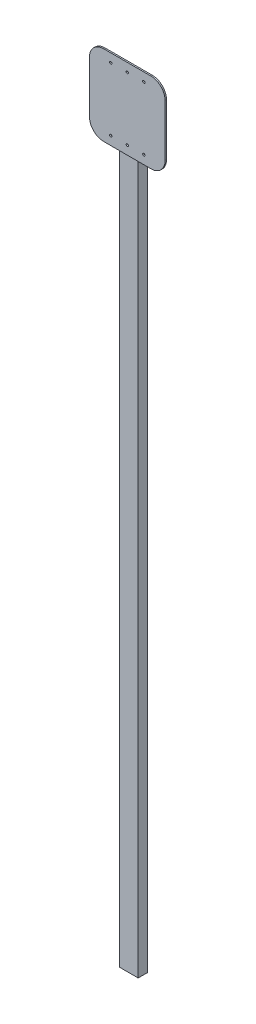
ISO-10303-21;
HEADER;
FILE_DESCRIPTION(('STEP AP214'),'2;1');
FILE_NAME('part.step','',(''),(''),'','','');
FILE_SCHEMA(('AUTOMOTIVE_DESIGN { 1 0 10303 214 1 1 1 1 }'));
ENDSEC;
DATA;
#1=APPLICATION_CONTEXT('core data for automotive mechanical design processes');
#2=APPLICATION_PROTOCOL_DEFINITION('international standard','automotive_design',2000,#1);
#3=PRODUCT_CONTEXT('',#1,'mechanical');
#4=PRODUCT('Part','Part','',(#3));
#5=PRODUCT_RELATED_PRODUCT_CATEGORY('part','',(#4));
#6=PRODUCT_DEFINITION_FORMATION('','',#4);
#7=PRODUCT_DEFINITION_CONTEXT('part definition',#1,'design');
#8=PRODUCT_DEFINITION('design','',#6,#7);
#9=PRODUCT_DEFINITION_SHAPE('','',#8);
#10=(LENGTH_UNIT() NAMED_UNIT(*) SI_UNIT(.MILLI.,.METRE.));
#11=(NAMED_UNIT(*) PLANE_ANGLE_UNIT() SI_UNIT($,.RADIAN.));
#12=(NAMED_UNIT(*) SI_UNIT($,.STERADIAN.) SOLID_ANGLE_UNIT());
#13=UNCERTAINTY_MEASURE_WITH_UNIT(LENGTH_MEASURE(1.E-05),#10,'distance_accuracy_value','');
#14=(GEOMETRIC_REPRESENTATION_CONTEXT(3) GLOBAL_UNCERTAINTY_ASSIGNED_CONTEXT((#13)) GLOBAL_UNIT_ASSIGNED_CONTEXT((#10,
#11,#12)) REPRESENTATION_CONTEXT('',''));
#15=CARTESIAN_POINT('',(0.,0.,0.));
#16=DIRECTION('',(0.,0.,1.));
#17=DIRECTION('',(1.,0.,0.));
#18=AXIS2_PLACEMENT_3D('',#15,#16,#17);
#19=CARTESIAN_POINT('',(-50.,-55.0000000000001,3.));
#20=DIRECTION('',(0.,0.,1.));
#21=DIRECTION('',(1.,0.,0.));
#22=AXIS2_PLACEMENT_3D('',#19,#20,#21);
#23=PLANE('',#22);
#24=CARTESIAN_POINT('',(-35.,-66.75,3.));
#25=DIRECTION('',(0.,0.,1.));
#26=DIRECTION('',(1.,0.,0.));
#27=AXIS2_PLACEMENT_3D('',#24,#25,#26);
#28=CIRCLE('',#27,2.5);
#29=CARTESIAN_POINT('',(-32.5,-66.75,3.));
#30=VERTEX_POINT('',#29);
#31=EDGE_CURVE('E229',#30,#30,#28,.T.);
#32=ORIENTED_EDGE('',*,*,#31,.F.);
#33=EDGE_LOOP('',(#32));
#34=FACE_BOUND('',#33,.T.);
#35=CARTESIAN_POINT('',(-35.,66.75,3.));
#36=DIRECTION('',(0.,0.,1.));
#37=DIRECTION('',(1.,0.,0.));
#38=AXIS2_PLACEMENT_3D('',#35,#36,#37);
#39=CIRCLE('',#38,2.5);
#40=CARTESIAN_POINT('',(-32.5,66.75,3.));
#41=VERTEX_POINT('',#40);
#42=EDGE_CURVE('E241',#41,#41,#39,.T.);
#43=ORIENTED_EDGE('',*,*,#42,.F.);
#44=EDGE_LOOP('',(#43));
#45=FACE_BOUND('',#44,.T.);
#46=CARTESIAN_POINT('',(0.,-66.75,3.));
#47=DIRECTION('',(0.,0.,1.));
#48=DIRECTION('',(1.,0.,0.));
#49=AXIS2_PLACEMENT_3D('',#46,#47,#48);
#50=CIRCLE('',#49,2.5);
#51=CARTESIAN_POINT('',(2.5,-66.75,3.));
#52=VERTEX_POINT('',#51);
#53=EDGE_CURVE('E150',#52,#52,#50,.T.);
#54=ORIENTED_EDGE('',*,*,#53,.F.);
#55=EDGE_LOOP('',(#54));
#56=FACE_BOUND('',#55,.T.);
#57=CARTESIAN_POINT('',(-50.,-55.0000000000001,3.));
#58=DIRECTION('',(0.,0.,1.));
#59=DIRECTION('',(1.,0.,0.));
#60=AXIS2_PLACEMENT_3D('',#57,#58,#59);
#61=CIRCLE('',#60,30.);
#62=CARTESIAN_POINT('',(-80.,-54.9999999999999,3.));
#63=VERTEX_POINT('',#62);
#64=CARTESIAN_POINT('',(-49.9999999999999,-85.0000000000001,3.));
#65=VERTEX_POINT('',#64);
#66=EDGE_CURVE('E165',#63,#65,#61,.T.);
#67=ORIENTED_EDGE('',*,*,#66,.T.);
#68=DIRECTION('',(1.,0.,0.));
#69=VECTOR('',#68,1.);
#70=CARTESIAN_POINT('',(49.9999999999994,-85.0000000000003,3.));
#71=LINE('',#70,#69);
#72=CARTESIAN_POINT('',(49.9999999999994,-85.0000000000003,3.));
#73=VERTEX_POINT('',#72);
#74=EDGE_CURVE('E103',#65,#73,#71,.T.);
#75=ORIENTED_EDGE('',*,*,#74,.T.);
#76=CARTESIAN_POINT('',(49.9999999999997,-55.0000000000003,3.));
#77=DIRECTION('',(0.,0.,1.));
#78=DIRECTION('',(1.,0.,0.));
#79=AXIS2_PLACEMENT_3D('',#76,#77,#78);
#80=CIRCLE('',#79,30.);
#81=CARTESIAN_POINT('',(79.9999999999997,-55.0000000000001,3.));
#82=VERTEX_POINT('',#81);
#83=EDGE_CURVE('E256',#73,#82,#80,.T.);
#84=ORIENTED_EDGE('',*,*,#83,.T.);
#85=DIRECTION('',(0.,1.,0.));
#86=VECTOR('',#85,1.);
#87=CARTESIAN_POINT('',(79.9999999999999,54.9999999999997,3.));
#88=LINE('',#87,#86);
#89=CARTESIAN_POINT('',(79.9999999999999,54.9999999999997,3.));
#90=VERTEX_POINT('',#89);
#91=EDGE_CURVE('E258',#82,#90,#88,.T.);
#92=ORIENTED_EDGE('',*,*,#91,.T.);
#93=CARTESIAN_POINT('',(49.9999999999999,55.,3.));
#94=DIRECTION('',(0.,0.,1.));
#95=DIRECTION('',(1.,0.,0.));
#96=AXIS2_PLACEMENT_3D('',#93,#94,#95);
#97=CIRCLE('',#96,30.);
#98=CARTESIAN_POINT('',(49.9999999999997,85.,3.));
#99=VERTEX_POINT('',#98);
#100=EDGE_CURVE('E125',#90,#99,#97,.T.);
#101=ORIENTED_EDGE('',*,*,#100,.T.);
#102=DIRECTION('',(-1.,0.,0.));
#103=VECTOR('',#102,1.);
#104=CARTESIAN_POINT('',(-49.9999999999999,84.9999999999999,3.));
#105=LINE('',#104,#103);
#106=CARTESIAN_POINT('',(-49.9999999999999,84.9999999999999,3.));
#107=VERTEX_POINT('',#106);
#108=EDGE_CURVE('E118',#99,#107,#105,.T.);
#109=ORIENTED_EDGE('',*,*,#108,.T.);
#110=CARTESIAN_POINT('',(-50.0000000000001,54.9999999999999,3.));
#111=DIRECTION('',(0.,0.,1.));
#112=DIRECTION('',(-1.,0.,0.));
#113=AXIS2_PLACEMENT_3D('',#110,#111,#112);
#114=CIRCLE('',#113,30.);
#115=CARTESIAN_POINT('',(-80.0000000000001,54.9999999999997,3.));
#116=VERTEX_POINT('',#115);
#117=EDGE_CURVE('E122',#107,#116,#114,.T.);
#118=ORIENTED_EDGE('',*,*,#117,.T.);
#119=DIRECTION('',(0.,-1.,0.));
#120=VECTOR('',#119,1.);
#121=CARTESIAN_POINT('',(-80.0000000000001,54.9999999999997,3.));
#122=LINE('',#121,#120);
#123=EDGE_CURVE('E61',#116,#63,#122,.T.);
#124=ORIENTED_EDGE('',*,*,#123,.T.);
#125=EDGE_LOOP('',(#67,#75,#84,#92,#101,#109,#118,#124));
#126=FACE_BOUND('',#125,.T.);
#127=CARTESIAN_POINT('',(0.,66.75,3.));
#128=DIRECTION('',(0.,0.,1.));
#129=DIRECTION('',(1.,0.,0.));
#130=AXIS2_PLACEMENT_3D('',#127,#128,#129);
#131=CIRCLE('',#130,2.5);
#132=CARTESIAN_POINT('',(2.5,66.75,3.));
#133=VERTEX_POINT('',#132);
#134=EDGE_CURVE('E247',#133,#133,#131,.T.);
#135=ORIENTED_EDGE('',*,*,#134,.F.);
#136=EDGE_LOOP('',(#135));
#137=FACE_BOUND('',#136,.T.);
#138=CARTESIAN_POINT('',(35.,66.75,3.));
#139=DIRECTION('',(0.,0.,1.));
#140=DIRECTION('',(1.,0.,0.));
#141=AXIS2_PLACEMENT_3D('',#138,#139,#140);
#142=CIRCLE('',#141,2.5);
#143=CARTESIAN_POINT('',(37.5,66.75,3.));
#144=VERTEX_POINT('',#143);
#145=EDGE_CURVE('E235',#144,#144,#142,.T.);
#146=ORIENTED_EDGE('',*,*,#145,.F.);
#147=EDGE_LOOP('',(#146));
#148=FACE_BOUND('',#147,.T.);
#149=CARTESIAN_POINT('',(35.,-66.75,3.));
#150=DIRECTION('',(0.,0.,1.));
#151=DIRECTION('',(1.,0.,0.));
#152=AXIS2_PLACEMENT_3D('',#149,#150,#151);
#153=CIRCLE('',#152,2.5);
#154=CARTESIAN_POINT('',(37.5,-66.75,3.));
#155=VERTEX_POINT('',#154);
#156=EDGE_CURVE('E223',#155,#155,#153,.T.);
#157=ORIENTED_EDGE('',*,*,#156,.F.);
#158=EDGE_LOOP('',(#157));
#159=FACE_BOUND('',#158,.T.);
#160=ADVANCED_FACE('F35',(#34,#45,#56,#126,#137,#148,#159),#23,.T.);
#161=CARTESIAN_POINT('',(-50.,-55.0000000000001,0.));
#162=DIRECTION('',(0.,0.,1.));
#163=DIRECTION('',(1.,0.,0.));
#164=AXIS2_PLACEMENT_3D('',#161,#162,#163);
#165=PLANE('',#164);
#166=DIRECTION('',(-1.,0.,0.));
#167=VECTOR('',#166,1.);
#168=CARTESIAN_POINT('',(-20.,0.,0.));
#169=LINE('',#168,#167);
#170=CARTESIAN_POINT('',(20.,0.,0.));
#171=VERTEX_POINT('',#170);
#172=CARTESIAN_POINT('',(-20.,0.,0.));
#173=VERTEX_POINT('',#172);
#174=EDGE_CURVE('E52',#171,#173,#169,.T.);
#175=ORIENTED_EDGE('',*,*,#174,.T.);
#176=DIRECTION('',(0.,-1.,0.));
#177=VECTOR('',#176,1.);
#178=CARTESIAN_POINT('',(-20.,-1584.51476219569,0.));
#179=LINE('',#178,#177);
#180=CARTESIAN_POINT('',(-20.,-85.0000000000002,0.));
#181=VERTEX_POINT('',#180);
#182=EDGE_CURVE('E191',#173,#181,#179,.T.);
#183=ORIENTED_EDGE('',*,*,#182,.T.);
#184=DIRECTION('',(1.,0.,0.));
#185=VECTOR('',#184,1.);
#186=CARTESIAN_POINT('',(49.9999999999994,-85.0000000000003,0.));
#187=LINE('',#186,#185);
#188=CARTESIAN_POINT('',(-49.9999999999999,-85.0000000000001,0.));
#189=VERTEX_POINT('',#188);
#190=EDGE_CURVE('E151',#189,#181,#187,.T.);
#191=ORIENTED_EDGE('',*,*,#190,.F.);
#192=CARTESIAN_POINT('',(-50.,-55.0000000000001,0.));
#193=DIRECTION('',(0.,0.,1.));
#194=DIRECTION('',(1.,0.,0.));
#195=AXIS2_PLACEMENT_3D('',#192,#193,#194);
#196=CIRCLE('',#195,30.);
#197=CARTESIAN_POINT('',(-80.,-54.9999999999999,0.));
#198=VERTEX_POINT('',#197);
#199=EDGE_CURVE('E146',#198,#189,#196,.T.);
#200=ORIENTED_EDGE('',*,*,#199,.F.);
#201=DIRECTION('',(0.,-1.,0.));
#202=VECTOR('',#201,1.);
#203=CARTESIAN_POINT('',(-80.0000000000001,54.9999999999997,0.));
#204=LINE('',#203,#202);
#205=CARTESIAN_POINT('',(-80.0000000000001,54.9999999999997,0.));
#206=VERTEX_POINT('',#205);
#207=EDGE_CURVE('E94',#206,#198,#204,.T.);
#208=ORIENTED_EDGE('',*,*,#207,.F.);
#209=CARTESIAN_POINT('',(-50.0000000000001,54.9999999999999,0.));
#210=DIRECTION('',(0.,0.,1.));
#211=DIRECTION('',(-1.,0.,0.));
#212=AXIS2_PLACEMENT_3D('',#209,#210,#211);
#213=CIRCLE('',#212,30.);
#214=CARTESIAN_POINT('',(-49.9999999999999,84.9999999999999,0.));
#215=VERTEX_POINT('',#214);
#216=EDGE_CURVE('E162',#215,#206,#213,.T.);
#217=ORIENTED_EDGE('',*,*,#216,.F.);
#218=DIRECTION('',(-1.,0.,0.));
#219=VECTOR('',#218,1.);
#220=CARTESIAN_POINT('',(-49.9999999999999,84.9999999999999,0.));
#221=LINE('',#220,#219);
#222=CARTESIAN_POINT('',(49.9999999999997,85.,0.));
#223=VERTEX_POINT('',#222);
#224=EDGE_CURVE('E134',#223,#215,#221,.T.);
#225=ORIENTED_EDGE('',*,*,#224,.F.);
#226=CARTESIAN_POINT('',(49.9999999999999,55.,0.));
#227=DIRECTION('',(0.,0.,1.));
#228=DIRECTION('',(1.,0.,0.));
#229=AXIS2_PLACEMENT_3D('',#226,#227,#228);
#230=CIRCLE('',#229,30.);
#231=CARTESIAN_POINT('',(79.9999999999999,54.9999999999997,0.));
#232=VERTEX_POINT('',#231);
#233=EDGE_CURVE('E159',#232,#223,#230,.T.);
#234=ORIENTED_EDGE('',*,*,#233,.F.);
#235=DIRECTION('',(0.,1.,0.));
#236=VECTOR('',#235,1.);
#237=CARTESIAN_POINT('',(79.9999999999999,54.9999999999997,0.));
#238=LINE('',#237,#236);
#239=CARTESIAN_POINT('',(79.9999999999997,-55.0000000000001,0.));
#240=VERTEX_POINT('',#239);
#241=EDGE_CURVE('E157',#240,#232,#238,.T.);
#242=ORIENTED_EDGE('',*,*,#241,.F.);
#243=CARTESIAN_POINT('',(49.9999999999997,-55.0000000000003,0.));
#244=DIRECTION('',(0.,0.,1.));
#245=DIRECTION('',(1.,0.,0.));
#246=AXIS2_PLACEMENT_3D('',#243,#244,#245);
#247=CIRCLE('',#246,30.);
#248=CARTESIAN_POINT('',(49.9999999999994,-85.0000000000003,0.));
#249=VERTEX_POINT('',#248);
#250=EDGE_CURVE('E154',#249,#240,#247,.T.);
#251=ORIENTED_EDGE('',*,*,#250,.F.);
#252=CARTESIAN_POINT('',(20.,-85.0000000000002,0.));
#253=VERTEX_POINT('',#252);
#254=EDGE_CURVE('E149',#253,#249,#187,.T.);
#255=ORIENTED_EDGE('',*,*,#254,.F.);
#256=DIRECTION('',(0.,1.,0.));
#257=VECTOR('',#256,1.);
#258=CARTESIAN_POINT('',(20.,0.,0.));
#259=LINE('',#258,#257);
#260=EDGE_CURVE('E11',#253,#171,#259,.T.);
#261=ORIENTED_EDGE('',*,*,#260,.T.);
#262=EDGE_LOOP('',(#175,#183,#191,#200,#208,#217,#225,#234,#242,#251,#255,#261));
#263=FACE_BOUND('',#262,.T.);
#264=CARTESIAN_POINT('',(0.,66.75,0.));
#265=DIRECTION('',(0.,0.,1.));
#266=DIRECTION('',(1.,0.,0.));
#267=AXIS2_PLACEMENT_3D('',#264,#265,#266);
#268=CIRCLE('',#267,2.5);
#269=CARTESIAN_POINT('',(2.5,66.75,0.));
#270=VERTEX_POINT('',#269);
#271=EDGE_CURVE('E244',#270,#270,#268,.T.);
#272=ORIENTED_EDGE('',*,*,#271,.T.);
#273=EDGE_LOOP('',(#272));
#274=FACE_BOUND('',#273,.T.);
#275=CARTESIAN_POINT('',(-35.,66.75,0.));
#276=DIRECTION('',(0.,0.,1.));
#277=DIRECTION('',(1.,0.,0.));
#278=AXIS2_PLACEMENT_3D('',#275,#276,#277);
#279=CIRCLE('',#278,2.5);
#280=CARTESIAN_POINT('',(-32.5,66.75,0.));
#281=VERTEX_POINT('',#280);
#282=EDGE_CURVE('E238',#281,#281,#279,.T.);
#283=ORIENTED_EDGE('',*,*,#282,.T.);
#284=EDGE_LOOP('',(#283));
#285=FACE_BOUND('',#284,.T.);
#286=CARTESIAN_POINT('',(35.,66.75,0.));
#287=DIRECTION('',(0.,0.,1.));
#288=DIRECTION('',(1.,0.,0.));
#289=AXIS2_PLACEMENT_3D('',#286,#287,#288);
#290=CIRCLE('',#289,2.5);
#291=CARTESIAN_POINT('',(37.5,66.75,0.));
#292=VERTEX_POINT('',#291);
#293=EDGE_CURVE('E232',#292,#292,#290,.T.);
#294=ORIENTED_EDGE('',*,*,#293,.T.);
#295=EDGE_LOOP('',(#294));
#296=FACE_BOUND('',#295,.T.);
#297=CARTESIAN_POINT('',(-35.,-66.75,0.));
#298=DIRECTION('',(0.,0.,1.));
#299=DIRECTION('',(1.,0.,0.));
#300=AXIS2_PLACEMENT_3D('',#297,#298,#299);
#301=CIRCLE('',#300,2.5);
#302=CARTESIAN_POINT('',(-32.5,-66.75,0.));
#303=VERTEX_POINT('',#302);
#304=EDGE_CURVE('E226',#303,#303,#301,.T.);
#305=ORIENTED_EDGE('',*,*,#304,.T.);
#306=EDGE_LOOP('',(#305));
#307=FACE_BOUND('',#306,.T.);
#308=CARTESIAN_POINT('',(35.,-66.75,0.));
#309=DIRECTION('',(0.,0.,1.));
#310=DIRECTION('',(1.,0.,0.));
#311=AXIS2_PLACEMENT_3D('',#308,#309,#310);
#312=CIRCLE('',#311,2.5);
#313=CARTESIAN_POINT('',(37.5,-66.75,0.));
#314=VERTEX_POINT('',#313);
#315=EDGE_CURVE('E214',#314,#314,#312,.T.);
#316=ORIENTED_EDGE('',*,*,#315,.T.);
#317=EDGE_LOOP('',(#316));
#318=FACE_BOUND('',#317,.T.);
#319=ADVANCED_FACE('F187',(#263,#274,#285,#296,#307,#318),#165,.F.);
#320=CARTESIAN_POINT('',(-50.,-55.0000000000001,3.));
#321=DIRECTION('',(0.,0.,-1.));
#322=DIRECTION('',(-1.,0.,0.));
#323=AXIS2_PLACEMENT_3D('',#320,#321,#322);
#324=CYLINDRICAL_SURFACE('',#323,30.);
#325=ORIENTED_EDGE('',*,*,#199,.T.);
#326=DIRECTION('',(0.,0.,-1.));
#327=VECTOR('',#326,1.);
#328=CARTESIAN_POINT('',(-49.9999999999999,-85.0000000000001,3.));
#329=LINE('',#328,#327);
#330=EDGE_CURVE('E39',#65,#189,#329,.T.);
#331=ORIENTED_EDGE('',*,*,#330,.F.);
#332=ORIENTED_EDGE('',*,*,#66,.F.);
#333=DIRECTION('',(0.,0.,-1.));
#334=VECTOR('',#333,1.);
#335=CARTESIAN_POINT('',(-80.,-54.9999999999999,3.));
#336=LINE('',#335,#334);
#337=EDGE_CURVE('E142',#63,#198,#336,.T.);
#338=ORIENTED_EDGE('',*,*,#337,.T.);
#339=EDGE_LOOP('',(#325,#331,#332,#338));
#340=FACE_BOUND('',#339,.T.);
#341=ADVANCED_FACE('F37',(#340),#324,.T.);
#342=CARTESIAN_POINT('',(49.9999999999994,-85.0000000000003,3.));
#343=DIRECTION('',(0.,1.,0.));
#344=DIRECTION('',(-1.,0.,0.));
#345=AXIS2_PLACEMENT_3D('',#342,#343,#344);
#346=PLANE('',#345);
#347=ORIENTED_EDGE('',*,*,#190,.T.);
#348=EDGE_CURVE('E155',#181,#253,#187,.T.);
#349=ORIENTED_EDGE('',*,*,#348,.T.);
#350=ORIENTED_EDGE('',*,*,#254,.T.);
#351=DIRECTION('',(0.,0.,-1.));
#352=VECTOR('',#351,1.);
#353=CARTESIAN_POINT('',(49.9999999999994,-85.0000000000003,3.));
#354=LINE('',#353,#352);
#355=EDGE_CURVE('E174',#73,#249,#354,.T.);
#356=ORIENTED_EDGE('',*,*,#355,.F.);
#357=ORIENTED_EDGE('',*,*,#74,.F.);
#358=ORIENTED_EDGE('',*,*,#330,.T.);
#359=EDGE_LOOP('',(#347,#349,#350,#356,#357,#358));
#360=FACE_BOUND('',#359,.T.);
#361=ADVANCED_FACE('F180',(#360),#346,.F.);
#362=CARTESIAN_POINT('',(49.9999999999997,-55.0000000000003,3.));
#363=DIRECTION('',(0.,0.,-1.));
#364=DIRECTION('',(-1.,0.,0.));
#365=AXIS2_PLACEMENT_3D('',#362,#363,#364);
#366=CYLINDRICAL_SURFACE('',#365,30.);
#367=ORIENTED_EDGE('',*,*,#250,.T.);
#368=DIRECTION('',(0.,0.,-1.));
#369=VECTOR('',#368,1.);
#370=CARTESIAN_POINT('',(79.9999999999997,-55.0000000000001,3.));
#371=LINE('',#370,#369);
#372=EDGE_CURVE('E172',#82,#240,#371,.T.);
#373=ORIENTED_EDGE('',*,*,#372,.F.);
#374=ORIENTED_EDGE('',*,*,#83,.F.);
#375=ORIENTED_EDGE('',*,*,#355,.T.);
#376=EDGE_LOOP('',(#367,#373,#374,#375));
#377=FACE_BOUND('',#376,.T.);
#378=ADVANCED_FACE('F270',(#377),#366,.T.);
#379=CARTESIAN_POINT('',(79.9999999999999,54.9999999999997,3.));
#380=DIRECTION('',(-1.,0.,0.));
#381=DIRECTION('',(0.,-1.,0.));
#382=AXIS2_PLACEMENT_3D('',#379,#380,#381);
#383=PLANE('',#382);
#384=ORIENTED_EDGE('',*,*,#241,.T.);
#385=DIRECTION('',(0.,0.,-1.));
#386=VECTOR('',#385,1.);
#387=CARTESIAN_POINT('',(79.9999999999999,54.9999999999997,3.));
#388=LINE('',#387,#386);
#389=EDGE_CURVE('E169',#90,#232,#388,.T.);
#390=ORIENTED_EDGE('',*,*,#389,.F.);
#391=ORIENTED_EDGE('',*,*,#91,.F.);
#392=ORIENTED_EDGE('',*,*,#372,.T.);
#393=EDGE_LOOP('',(#384,#390,#391,#392));
#394=FACE_BOUND('',#393,.T.);
#395=ADVANCED_FACE('F263',(#394),#383,.F.);
#396=CARTESIAN_POINT('',(49.9999999999999,55.,3.));
#397=DIRECTION('',(0.,0.,-1.));
#398=DIRECTION('',(-1.,0.,0.));
#399=AXIS2_PLACEMENT_3D('',#396,#397,#398);
#400=CYLINDRICAL_SURFACE('',#399,30.);
#401=ORIENTED_EDGE('',*,*,#233,.T.);
#402=DIRECTION('',(0.,0.,-1.));
#403=VECTOR('',#402,1.);
#404=CARTESIAN_POINT('',(49.9999999999997,85.,3.));
#405=LINE('',#404,#403);
#406=EDGE_CURVE('E137',#99,#223,#405,.T.);
#407=ORIENTED_EDGE('',*,*,#406,.F.);
#408=ORIENTED_EDGE('',*,*,#100,.F.);
#409=ORIENTED_EDGE('',*,*,#389,.T.);
#410=EDGE_LOOP('',(#401,#407,#408,#409));
#411=FACE_BOUND('',#410,.T.);
#412=ADVANCED_FACE('F267',(#411),#400,.T.);
#413=CARTESIAN_POINT('',(-49.9999999999999,84.9999999999999,3.));
#414=DIRECTION('',(0.,-1.,0.));
#415=DIRECTION('',(1.,0.,0.));
#416=AXIS2_PLACEMENT_3D('',#413,#414,#415);
#417=PLANE('',#416);
#418=ORIENTED_EDGE('',*,*,#224,.T.);
#419=DIRECTION('',(0.,0.,-1.));
#420=VECTOR('',#419,1.);
#421=CARTESIAN_POINT('',(-49.9999999999999,84.9999999999999,3.));
#422=LINE('',#421,#420);
#423=EDGE_CURVE('E131',#107,#215,#422,.T.);
#424=ORIENTED_EDGE('',*,*,#423,.F.);
#425=ORIENTED_EDGE('',*,*,#108,.F.);
#426=ORIENTED_EDGE('',*,*,#406,.T.);
#427=EDGE_LOOP('',(#418,#424,#425,#426));
#428=FACE_BOUND('',#427,.T.);
#429=ADVANCED_FACE('F132',(#428),#417,.F.);
#430=CARTESIAN_POINT('',(-50.0000000000001,54.9999999999999,3.));
#431=DIRECTION('',(0.,0.,-1.));
#432=DIRECTION('',(-1.,0.,0.));
#433=AXIS2_PLACEMENT_3D('',#430,#431,#432);
#434=CYLINDRICAL_SURFACE('',#433,30.);
#435=ORIENTED_EDGE('',*,*,#216,.T.);
#436=DIRECTION('',(0.,0.,-1.));
#437=VECTOR('',#436,1.);
#438=CARTESIAN_POINT('',(-80.0000000000001,54.9999999999997,3.));
#439=LINE('',#438,#437);
#440=EDGE_CURVE('E138',#116,#206,#439,.T.);
#441=ORIENTED_EDGE('',*,*,#440,.F.);
#442=ORIENTED_EDGE('',*,*,#117,.F.);
#443=ORIENTED_EDGE('',*,*,#423,.T.);
#444=EDGE_LOOP('',(#435,#441,#442,#443));
#445=FACE_BOUND('',#444,.T.);
#446=ADVANCED_FACE('F140',(#445),#434,.T.);
#447=CARTESIAN_POINT('',(-80.0000000000001,54.9999999999997,3.));
#448=DIRECTION('',(1.,0.,0.));
#449=DIRECTION('',(0.,1.,0.));
#450=AXIS2_PLACEMENT_3D('',#447,#448,#449);
#451=PLANE('',#450);
#452=ORIENTED_EDGE('',*,*,#207,.T.);
#453=ORIENTED_EDGE('',*,*,#337,.F.);
#454=ORIENTED_EDGE('',*,*,#123,.F.);
#455=ORIENTED_EDGE('',*,*,#440,.T.);
#456=EDGE_LOOP('',(#452,#453,#454,#455));
#457=FACE_BOUND('',#456,.T.);
#458=ADVANCED_FACE('F268',(#457),#451,.F.);
#459=CARTESIAN_POINT('',(0.,-66.75,3.));
#460=DIRECTION('',(0.,0.,-1.));
#461=DIRECTION('',(-1.,0.,0.));
#462=AXIS2_PLACEMENT_3D('',#459,#460,#461);
#463=CYLINDRICAL_SURFACE('',#462,2.5);
#464=ORIENTED_EDGE('',*,*,#53,.T.);
#465=EDGE_LOOP('',(#464));
#466=FACE_BOUND('',#465,.T.);
#467=CARTESIAN_POINT('',(0.,-66.75,-20.));
#468=DIRECTION('',(0.,0.,1.));
#469=DIRECTION('',(1.,0.,0.));
#470=AXIS2_PLACEMENT_3D('',#467,#468,#469);
#471=CIRCLE('',#470,2.50000000000001);
#472=CARTESIAN_POINT('',(2.50000000000001,-66.75,-20.));
#473=VERTEX_POINT('',#472);
#474=EDGE_CURVE('E204',#473,#473,#471,.F.);
#475=ORIENTED_EDGE('',*,*,#474,.T.);
#476=EDGE_LOOP('',(#475));
#477=FACE_BOUND('',#476,.T.);
#478=ADVANCED_FACE('F313',(#466,#477),#463,.F.);
#479=CARTESIAN_POINT('',(0.,66.75,3.));
#480=DIRECTION('',(0.,0.,-1.));
#481=DIRECTION('',(-1.,0.,0.));
#482=AXIS2_PLACEMENT_3D('',#479,#480,#481);
#483=CYLINDRICAL_SURFACE('',#482,2.5);
#484=ORIENTED_EDGE('',*,*,#134,.T.);
#485=EDGE_LOOP('',(#484));
#486=FACE_BOUND('',#485,.T.);
#487=ORIENTED_EDGE('',*,*,#271,.F.);
#488=EDGE_LOOP('',(#487));
#489=FACE_BOUND('',#488,.T.);
#490=ADVANCED_FACE('F423',(#486,#489),#483,.F.);
#491=CARTESIAN_POINT('',(-35.,66.75,3.));
#492=DIRECTION('',(0.,0.,-1.));
#493=DIRECTION('',(-1.,0.,0.));
#494=AXIS2_PLACEMENT_3D('',#491,#492,#493);
#495=CYLINDRICAL_SURFACE('',#494,2.5);
#496=ORIENTED_EDGE('',*,*,#42,.T.);
#497=EDGE_LOOP('',(#496));
#498=FACE_BOUND('',#497,.T.);
#499=ORIENTED_EDGE('',*,*,#282,.F.);
#500=EDGE_LOOP('',(#499));
#501=FACE_BOUND('',#500,.T.);
#502=ADVANCED_FACE('F453',(#498,#501),#495,.F.);
#503=CARTESIAN_POINT('',(35.,66.75,3.));
#504=DIRECTION('',(0.,0.,-1.));
#505=DIRECTION('',(-1.,0.,0.));
#506=AXIS2_PLACEMENT_3D('',#503,#504,#505);
#507=CYLINDRICAL_SURFACE('',#506,2.5);
#508=ORIENTED_EDGE('',*,*,#145,.T.);
#509=EDGE_LOOP('',(#508));
#510=FACE_BOUND('',#509,.T.);
#511=ORIENTED_EDGE('',*,*,#293,.F.);
#512=EDGE_LOOP('',(#511));
#513=FACE_BOUND('',#512,.T.);
#514=ADVANCED_FACE('F444',(#510,#513),#507,.F.);
#515=CARTESIAN_POINT('',(-35.,-66.75,3.));
#516=DIRECTION('',(0.,0.,-1.));
#517=DIRECTION('',(-1.,0.,0.));
#518=AXIS2_PLACEMENT_3D('',#515,#516,#517);
#519=CYLINDRICAL_SURFACE('',#518,2.5);
#520=ORIENTED_EDGE('',*,*,#31,.T.);
#521=EDGE_LOOP('',(#520));
#522=FACE_BOUND('',#521,.T.);
#523=ORIENTED_EDGE('',*,*,#304,.F.);
#524=EDGE_LOOP('',(#523));
#525=FACE_BOUND('',#524,.T.);
#526=ADVANCED_FACE('F323',(#522,#525),#519,.F.);
#527=CARTESIAN_POINT('',(35.,-66.75,3.));
#528=DIRECTION('',(0.,0.,-1.));
#529=DIRECTION('',(-1.,0.,0.));
#530=AXIS2_PLACEMENT_3D('',#527,#528,#529);
#531=CYLINDRICAL_SURFACE('',#530,2.5);
#532=ORIENTED_EDGE('',*,*,#156,.T.);
#533=EDGE_LOOP('',(#532));
#534=FACE_BOUND('',#533,.T.);
#535=ORIENTED_EDGE('',*,*,#315,.F.);
#536=EDGE_LOOP('',(#535));
#537=FACE_BOUND('',#536,.T.);
#538=ADVANCED_FACE('F316',(#534,#537),#531,.F.);
#539=CARTESIAN_POINT('',(0.,0.,-20.));
#540=DIRECTION('',(0.,0.,1.));
#541=DIRECTION('',(1.,0.,0.));
#542=AXIS2_PLACEMENT_3D('',#539,#540,#541);
#543=PLANE('',#542);
#544=ORIENTED_EDGE('',*,*,#474,.F.);
#545=EDGE_LOOP('',(#544));
#546=FACE_BOUND('',#545,.T.);
#547=DIRECTION('',(0.,-1.,0.));
#548=VECTOR('',#547,1.);
#549=CARTESIAN_POINT('',(-20.,0.,-20.));
#550=LINE('',#549,#548);
#551=CARTESIAN_POINT('',(-20.,0.,-20.));
#552=VERTEX_POINT('',#551);
#553=CARTESIAN_POINT('',(-20.,-1584.51476219569,-20.));
#554=VERTEX_POINT('',#553);
#555=EDGE_CURVE('E211',#552,#554,#550,.T.);
#556=ORIENTED_EDGE('',*,*,#555,.F.);
#557=DIRECTION('',(-1.,0.,0.));
#558=VECTOR('',#557,1.);
#559=CARTESIAN_POINT('',(-20.,0.,-20.));
#560=LINE('',#559,#558);
#561=CARTESIAN_POINT('',(20.,0.,-20.));
#562=VERTEX_POINT('',#561);
#563=EDGE_CURVE('E206',#562,#552,#560,.T.);
#564=ORIENTED_EDGE('',*,*,#563,.F.);
#565=DIRECTION('',(0.,1.,0.));
#566=VECTOR('',#565,1.);
#567=CARTESIAN_POINT('',(20.,-1584.51476219569,-20.));
#568=LINE('',#567,#566);
#569=CARTESIAN_POINT('',(20.,-1584.51476219569,-20.));
#570=VERTEX_POINT('',#569);
#571=EDGE_CURVE('E301',#570,#562,#568,.T.);
#572=ORIENTED_EDGE('',*,*,#571,.F.);
#573=DIRECTION('',(1.,0.,0.));
#574=VECTOR('',#573,1.);
#575=CARTESIAN_POINT('',(-20.,-1584.51476219569,-20.));
#576=LINE('',#575,#574);
#577=EDGE_CURVE('E305',#554,#570,#576,.T.);
#578=ORIENTED_EDGE('',*,*,#577,.F.);
#579=EDGE_LOOP('',(#556,#564,#572,#578));
#580=FACE_BOUND('',#579,.T.);
#581=ADVANCED_FACE('F304',(#546,#580),#543,.F.);
#582=CARTESIAN_POINT('',(-20.,-1584.51476219569,-20.));
#583=DIRECTION('',(-1.,0.,0.));
#584=DIRECTION('',(0.,0.,1.));
#585=AXIS2_PLACEMENT_3D('',#582,#583,#584);
#586=PLANE('',#585);
#587=ORIENTED_EDGE('',*,*,#182,.F.);
#588=DIRECTION('',(0.,0.,1.));
#589=VECTOR('',#588,1.);
#590=CARTESIAN_POINT('',(-20.,0.,-20.));
#591=LINE('',#590,#589);
#592=EDGE_CURVE('E212',#552,#173,#591,.T.);
#593=ORIENTED_EDGE('',*,*,#592,.F.);
#594=ORIENTED_EDGE('',*,*,#555,.T.);
#595=DIRECTION('',(0.,0.,1.));
#596=VECTOR('',#595,1.);
#597=CARTESIAN_POINT('',(-20.,-1584.51476219569,-20.));
#598=LINE('',#597,#596);
#599=CARTESIAN_POINT('',(-20.,-1584.51476219569,0.));
#600=VERTEX_POINT('',#599);
#601=EDGE_CURVE('E220',#554,#600,#598,.T.);
#602=ORIENTED_EDGE('',*,*,#601,.T.);
#603=EDGE_CURVE('E199',#181,#600,#179,.T.);
#604=ORIENTED_EDGE('',*,*,#603,.F.);
#605=EDGE_LOOP('',(#587,#593,#594,#602,#604));
#606=FACE_BOUND('',#605,.T.);
#607=ADVANCED_FACE('F276',(#606),#586,.T.);
#608=CARTESIAN_POINT('',(-20.,-1584.51476219569,-20.));
#609=DIRECTION('',(0.,-1.,0.));
#610=DIRECTION('',(0.,0.,-1.));
#611=AXIS2_PLACEMENT_3D('',#608,#609,#610);
#612=PLANE('',#611);
#613=DIRECTION('',(1.,0.,0.));
#614=VECTOR('',#613,1.);
#615=CARTESIAN_POINT('',(-20.,-1584.51476219569,0.));
#616=LINE('',#615,#614);
#617=CARTESIAN_POINT('',(20.,-1584.51476219569,0.));
#618=VERTEX_POINT('',#617);
#619=EDGE_CURVE('E198',#600,#618,#616,.T.);
#620=ORIENTED_EDGE('',*,*,#619,.F.);
#621=ORIENTED_EDGE('',*,*,#601,.F.);
#622=ORIENTED_EDGE('',*,*,#577,.T.);
#623=DIRECTION('',(0.,0.,1.));
#624=VECTOR('',#623,1.);
#625=CARTESIAN_POINT('',(20.,-1584.51476219569,-20.));
#626=LINE('',#625,#624);
#627=EDGE_CURVE('E217',#570,#618,#626,.T.);
#628=ORIENTED_EDGE('',*,*,#627,.T.);
#629=EDGE_LOOP('',(#620,#621,#622,#628));
#630=FACE_BOUND('',#629,.T.);
#631=ADVANCED_FACE('F287',(#630),#612,.T.);
#632=CARTESIAN_POINT('',(20.,0.,-20.));
#633=DIRECTION('',(1.,0.,0.));
#634=DIRECTION('',(0.,0.,-1.));
#635=AXIS2_PLACEMENT_3D('',#632,#633,#634);
#636=PLANE('',#635);
#637=EDGE_CURVE('E45',#618,#253,#259,.T.);
#638=ORIENTED_EDGE('',*,*,#637,.F.);
#639=ORIENTED_EDGE('',*,*,#627,.F.);
#640=ORIENTED_EDGE('',*,*,#571,.T.);
#641=DIRECTION('',(0.,0.,1.));
#642=VECTOR('',#641,1.);
#643=CARTESIAN_POINT('',(20.,0.,-20.));
#644=LINE('',#643,#642);
#645=EDGE_CURVE('E215',#562,#171,#644,.T.);
#646=ORIENTED_EDGE('',*,*,#645,.T.);
#647=ORIENTED_EDGE('',*,*,#260,.F.);
#648=EDGE_LOOP('',(#638,#639,#640,#646,#647));
#649=FACE_BOUND('',#648,.T.);
#650=ADVANCED_FACE('F300',(#649),#636,.T.);
#651=CARTESIAN_POINT('',(-20.,0.,-20.));
#652=DIRECTION('',(0.,1.,0.));
#653=DIRECTION('',(0.,0.,1.));
#654=AXIS2_PLACEMENT_3D('',#651,#652,#653);
#655=PLANE('',#654);
#656=ORIENTED_EDGE('',*,*,#174,.F.);
#657=ORIENTED_EDGE('',*,*,#645,.F.);
#658=ORIENTED_EDGE('',*,*,#563,.T.);
#659=ORIENTED_EDGE('',*,*,#592,.T.);
#660=EDGE_LOOP('',(#656,#657,#658,#659));
#661=FACE_BOUND('',#660,.T.);
#662=ADVANCED_FACE('F397',(#661),#655,.T.);
#663=CARTESIAN_POINT('',(0.,0.,0.));
#664=DIRECTION('',(0.,0.,1.));
#665=DIRECTION('',(1.,0.,0.));
#666=AXIS2_PLACEMENT_3D('',#663,#664,#665);
#667=PLANE('',#666);
#668=ORIENTED_EDGE('',*,*,#348,.F.);
#669=ORIENTED_EDGE('',*,*,#603,.T.);
#670=ORIENTED_EDGE('',*,*,#619,.T.);
#671=ORIENTED_EDGE('',*,*,#637,.T.);
#672=EDGE_LOOP('',(#668,#669,#670,#671));
#673=FACE_BOUND('',#672,.T.);
#674=ADVANCED_FACE('F273',(#673),#667,.T.);
#675=CLOSED_SHELL('',(#160,#319,#341,#361,#378,#395,#412,#429,#446,#458,#478,#490,#502,#514,
#526,#538,#581,#607,#631,#650,#662,#674));
#676=MANIFOLD_SOLID_BREP('B2',#675);
#677=ADVANCED_BREP_SHAPE_REPRESENTATION('',(#18,#676),#14);
#678=SHAPE_DEFINITION_REPRESENTATION(#9,#677);
ENDSEC;
END-ISO-10303-21;
